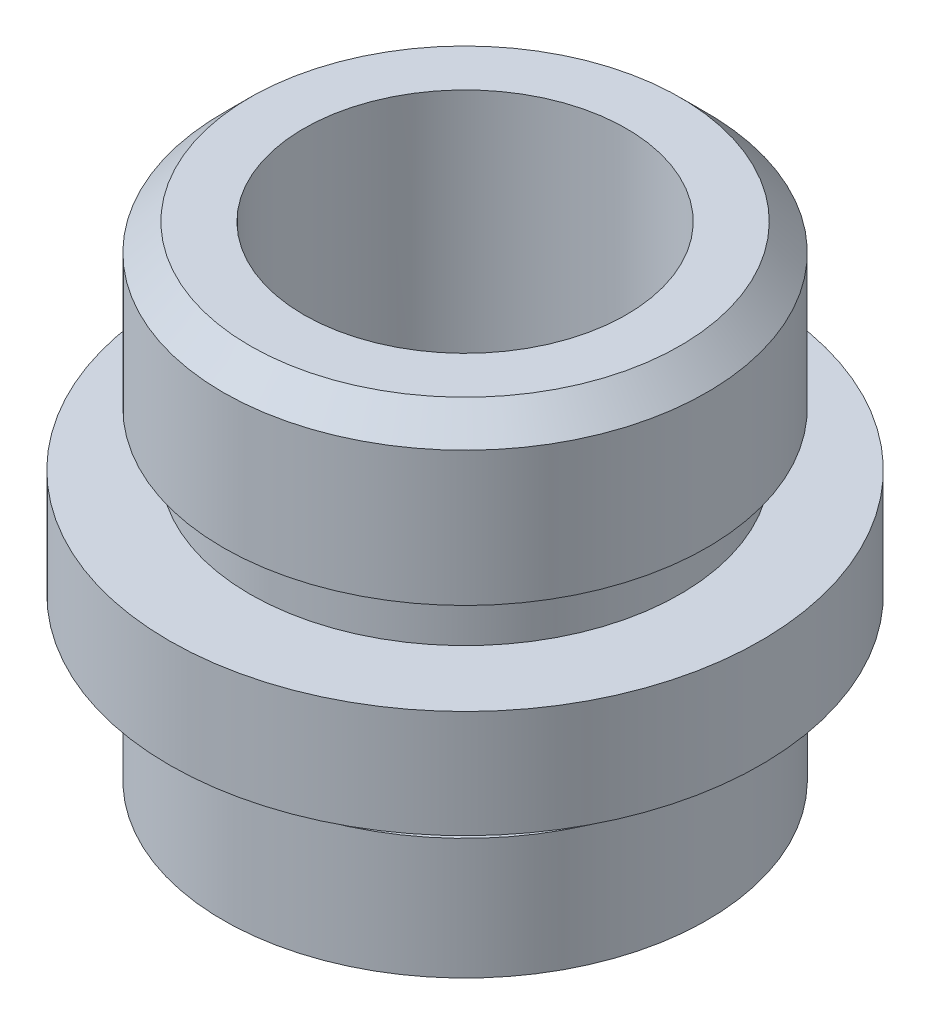
ISO-10303-21;
HEADER;
FILE_DESCRIPTION(('STEP AP214'),'2;1');
FILE_NAME('part.step','',(''),(''),'','','');
FILE_SCHEMA(('AUTOMOTIVE_DESIGN { 1 0 10303 214 1 1 1 1 }'));
ENDSEC;
DATA;
#1=APPLICATION_CONTEXT('core data for automotive mechanical design processes');
#2=APPLICATION_PROTOCOL_DEFINITION('international standard','automotive_design',2000,#1);
#3=PRODUCT_CONTEXT('',#1,'mechanical');
#4=PRODUCT('Part','Part','',(#3));
#5=PRODUCT_RELATED_PRODUCT_CATEGORY('part','',(#4));
#6=PRODUCT_DEFINITION_FORMATION('','',#4);
#7=PRODUCT_DEFINITION_CONTEXT('part definition',#1,'design');
#8=PRODUCT_DEFINITION('design','',#6,#7);
#9=PRODUCT_DEFINITION_SHAPE('','',#8);
#10=(LENGTH_UNIT() NAMED_UNIT(*) SI_UNIT(.MILLI.,.METRE.));
#11=(NAMED_UNIT(*) PLANE_ANGLE_UNIT() SI_UNIT($,.RADIAN.));
#12=(NAMED_UNIT(*) SI_UNIT($,.STERADIAN.) SOLID_ANGLE_UNIT());
#13=UNCERTAINTY_MEASURE_WITH_UNIT(LENGTH_MEASURE(1.E-05),#10,'distance_accuracy_value','');
#14=(GEOMETRIC_REPRESENTATION_CONTEXT(3) GLOBAL_UNCERTAINTY_ASSIGNED_CONTEXT((#13)) GLOBAL_UNIT_ASSIGNED_CONTEXT((#10,
#11,#12)) REPRESENTATION_CONTEXT('',''));
#15=CARTESIAN_POINT('',(0.,0.,0.));
#16=DIRECTION('',(0.,0.,1.));
#17=DIRECTION('',(1.,0.,0.));
#18=AXIS2_PLACEMENT_3D('',#15,#16,#17);
#19=CARTESIAN_POINT('',(0.,-4.,0.));
#20=DIRECTION('',(0.,1.,0.));
#21=DIRECTION('',(0.,0.,1.));
#22=AXIS2_PLACEMENT_3D('',#19,#20,#21);
#23=CYLINDRICAL_SURFACE('',#22,22.);
#24=CARTESIAN_POINT('',(0.,-4.,0.));
#25=DIRECTION('',(0.,1.,0.));
#26=DIRECTION('',(0.,0.,1.));
#27=AXIS2_PLACEMENT_3D('',#24,#25,#26);
#28=CIRCLE('',#27,22.);
#29=CARTESIAN_POINT('',(0.,-4.,22.));
#30=VERTEX_POINT('',#29);
#31=EDGE_CURVE('E61',#30,#30,#28,.T.);
#32=ORIENTED_EDGE('',*,*,#31,.T.);
#33=EDGE_LOOP('',(#32));
#34=FACE_BOUND('',#33,.T.);
#35=CARTESIAN_POINT('',(0.,4.,0.));
#36=DIRECTION('',(0.,1.,0.));
#37=DIRECTION('',(0.,0.,1.));
#38=AXIS2_PLACEMENT_3D('',#35,#36,#37);
#39=CIRCLE('',#38,22.);
#40=CARTESIAN_POINT('',(0.,4.,22.));
#41=VERTEX_POINT('',#40);
#42=EDGE_CURVE('E65',#41,#41,#39,.T.);
#43=ORIENTED_EDGE('',*,*,#42,.F.);
#44=EDGE_LOOP('',(#43));
#45=FACE_BOUND('',#44,.T.);
#46=ADVANCED_FACE('F39',(#34,#45),#23,.T.);
#47=CARTESIAN_POINT('',(0.,-4.,0.));
#48=DIRECTION('',(0.,1.,0.));
#49=DIRECTION('',(0.,0.,1.));
#50=AXIS2_PLACEMENT_3D('',#47,#48,#49);
#51=PLANE('',#50);
#52=CARTESIAN_POINT('',(0.,-4.,0.));
#53=DIRECTION('',(0.,-1.,0.));
#54=DIRECTION('',(0.,0.,-1.));
#55=AXIS2_PLACEMENT_3D('',#52,#53,#54);
#56=CIRCLE('',#55,16.);
#57=CARTESIAN_POINT('',(0.,-4.,-16.));
#58=VERTEX_POINT('',#57);
#59=EDGE_CURVE('E53',#58,#58,#56,.T.);
#60=ORIENTED_EDGE('',*,*,#59,.F.);
#61=EDGE_LOOP('',(#60));
#62=FACE_BOUND('',#61,.T.);
#63=ORIENTED_EDGE('',*,*,#31,.F.);
#64=EDGE_LOOP('',(#63));
#65=FACE_BOUND('',#64,.T.);
#66=ADVANCED_FACE('F120',(#62,#65),#51,.F.);
#67=CARTESIAN_POINT('',(0.,4.,0.));
#68=DIRECTION('',(0.,1.,0.));
#69=DIRECTION('',(0.,0.,1.));
#70=AXIS2_PLACEMENT_3D('',#67,#68,#69);
#71=PLANE('',#70);
#72=CARTESIAN_POINT('',(0.,4.,0.));
#73=DIRECTION('',(0.,1.,0.));
#74=DIRECTION('',(0.,0.,1.));
#75=AXIS2_PLACEMENT_3D('',#72,#73,#74);
#76=CIRCLE('',#75,16.);
#77=CARTESIAN_POINT('',(0.,4.,16.));
#78=VERTEX_POINT('',#77);
#79=EDGE_CURVE('E58',#78,#78,#76,.T.);
#80=ORIENTED_EDGE('',*,*,#79,.F.);
#81=EDGE_LOOP('',(#80));
#82=FACE_BOUND('',#81,.T.);
#83=ORIENTED_EDGE('',*,*,#42,.T.);
#84=EDGE_LOOP('',(#83));
#85=FACE_BOUND('',#84,.T.);
#86=ADVANCED_FACE('F125',(#82,#85),#71,.T.);
#87=CARTESIAN_POINT('',(0.,8.,0.));
#88=DIRECTION('',(0.,-1.,0.));
#89=DIRECTION('',(0.,0.,-1.));
#90=AXIS2_PLACEMENT_3D('',#87,#88,#89);
#91=CYLINDRICAL_SURFACE('',#90,16.);
#92=CARTESIAN_POINT('',(0.,8.,0.));
#93=DIRECTION('',(0.,1.,0.));
#94=DIRECTION('',(0.,0.,1.));
#95=AXIS2_PLACEMENT_3D('',#92,#93,#94);
#96=CIRCLE('',#95,16.);
#97=CARTESIAN_POINT('',(0.,8.,16.));
#98=VERTEX_POINT('',#97);
#99=EDGE_CURVE('E69',#98,#98,#96,.T.);
#100=ORIENTED_EDGE('',*,*,#99,.F.);
#101=EDGE_LOOP('',(#100));
#102=FACE_BOUND('',#101,.T.);
#103=ORIENTED_EDGE('',*,*,#79,.T.);
#104=EDGE_LOOP('',(#103));
#105=FACE_BOUND('',#104,.T.);
#106=ADVANCED_FACE('F116',(#102,#105),#91,.T.);
#107=CARTESIAN_POINT('',(0.,20.,0.));
#108=DIRECTION('',(0.,-1.,0.));
#109=DIRECTION('',(0.,0.,-1.));
#110=AXIS2_PLACEMENT_3D('',#107,#108,#109);
#111=CYLINDRICAL_SURFACE('',#110,18.);
#112=CARTESIAN_POINT('',(0.,18.,0.));
#113=DIRECTION('',(0.,1.,0.));
#114=DIRECTION('',(0.,0.,1.));
#115=AXIS2_PLACEMENT_3D('',#112,#113,#114);
#116=CIRCLE('',#115,18.);
#117=CARTESIAN_POINT('',(0.,18.,18.));
#118=VERTEX_POINT('',#117);
#119=EDGE_CURVE('E10',#118,#118,#116,.F.);
#120=ORIENTED_EDGE('',*,*,#119,.T.);
#121=EDGE_LOOP('',(#120));
#122=FACE_BOUND('',#121,.T.);
#123=CARTESIAN_POINT('',(0.,8.,0.));
#124=DIRECTION('',(0.,1.,0.));
#125=DIRECTION('',(0.,0.,1.));
#126=AXIS2_PLACEMENT_3D('',#123,#124,#125);
#127=CIRCLE('',#126,18.);
#128=CARTESIAN_POINT('',(0.,8.,18.));
#129=VERTEX_POINT('',#128);
#130=EDGE_CURVE('E76',#129,#129,#127,.T.);
#131=ORIENTED_EDGE('',*,*,#130,.T.);
#132=EDGE_LOOP('',(#131));
#133=FACE_BOUND('',#132,.T.);
#134=ADVANCED_FACE('F107',(#122,#133),#111,.T.);
#135=CARTESIAN_POINT('',(0.,20.,0.));
#136=DIRECTION('',(0.,1.,0.));
#137=DIRECTION('',(0.,0.,1.));
#138=AXIS2_PLACEMENT_3D('',#135,#136,#137);
#139=PLANE('',#138);
#140=CARTESIAN_POINT('',(0.,20.,0.));
#141=DIRECTION('',(0.,1.,0.));
#142=DIRECTION('',(0.,0.,1.));
#143=AXIS2_PLACEMENT_3D('',#140,#141,#142);
#144=CIRCLE('',#143,12.);
#145=CARTESIAN_POINT('',(0.,20.,12.));
#146=VERTEX_POINT('',#145);
#147=EDGE_CURVE('E96',#146,#146,#144,.T.);
#148=ORIENTED_EDGE('',*,*,#147,.F.);
#149=EDGE_LOOP('',(#148));
#150=FACE_BOUND('',#149,.T.);
#151=CARTESIAN_POINT('',(0.,20.,0.));
#152=DIRECTION('',(0.,1.,0.));
#153=DIRECTION('',(0.,0.,1.));
#154=AXIS2_PLACEMENT_3D('',#151,#152,#153);
#155=CIRCLE('',#154,16.);
#156=CARTESIAN_POINT('',(0.,20.,16.));
#157=VERTEX_POINT('',#156);
#158=EDGE_CURVE('E48',#157,#157,#155,.T.);
#159=ORIENTED_EDGE('',*,*,#158,.T.);
#160=EDGE_LOOP('',(#159));
#161=FACE_BOUND('',#160,.T.);
#162=ADVANCED_FACE('F104',(#150,#161),#139,.T.);
#163=CARTESIAN_POINT('',(0.,8.,0.));
#164=DIRECTION('',(0.,1.,0.));
#165=DIRECTION('',(0.,0.,1.));
#166=AXIS2_PLACEMENT_3D('',#163,#164,#165);
#167=PLANE('',#166);
#168=ORIENTED_EDGE('',*,*,#99,.T.);
#169=EDGE_LOOP('',(#168));
#170=FACE_BOUND('',#169,.T.);
#171=ORIENTED_EDGE('',*,*,#130,.F.);
#172=EDGE_LOOP('',(#171));
#173=FACE_BOUND('',#172,.T.);
#174=ADVANCED_FACE('F106',(#170,#173),#167,.F.);
#175=CARTESIAN_POINT('',(0.,-7.,0.));
#176=DIRECTION('',(0.,1.,0.));
#177=DIRECTION('',(0.,0.,1.));
#178=AXIS2_PLACEMENT_3D('',#175,#176,#177);
#179=CYLINDRICAL_SURFACE('',#178,16.);
#180=CARTESIAN_POINT('',(0.,-7.,0.));
#181=DIRECTION('',(0.,-1.,0.));
#182=DIRECTION('',(0.,0.,-1.));
#183=AXIS2_PLACEMENT_3D('',#180,#181,#182);
#184=CIRCLE('',#183,16.);
#185=CARTESIAN_POINT('',(0.,-7.,-16.));
#186=VERTEX_POINT('',#185);
#187=EDGE_CURVE('E79',#186,#186,#184,.T.);
#188=ORIENTED_EDGE('',*,*,#187,.F.);
#189=EDGE_LOOP('',(#188));
#190=FACE_BOUND('',#189,.T.);
#191=ORIENTED_EDGE('',*,*,#59,.T.);
#192=EDGE_LOOP('',(#191));
#193=FACE_BOUND('',#192,.T.);
#194=ADVANCED_FACE('F113',(#190,#193),#179,.T.);
#195=CARTESIAN_POINT('',(0.,-16.,0.));
#196=DIRECTION('',(0.,1.,0.));
#197=DIRECTION('',(0.,0.,1.));
#198=AXIS2_PLACEMENT_3D('',#195,#196,#197);
#199=CYLINDRICAL_SURFACE('',#198,18.);
#200=CARTESIAN_POINT('',(0.,-16.,0.));
#201=DIRECTION('',(0.,-1.,0.));
#202=DIRECTION('',(0.,0.,-1.));
#203=AXIS2_PLACEMENT_3D('',#200,#201,#202);
#204=CIRCLE('',#203,18.);
#205=CARTESIAN_POINT('',(0.,-16.,-18.));
#206=VERTEX_POINT('',#205);
#207=EDGE_CURVE('E84',#206,#206,#204,.T.);
#208=ORIENTED_EDGE('',*,*,#207,.F.);
#209=EDGE_LOOP('',(#208));
#210=FACE_BOUND('',#209,.T.);
#211=CARTESIAN_POINT('',(0.,-7.,0.));
#212=DIRECTION('',(0.,-1.,0.));
#213=DIRECTION('',(0.,0.,-1.));
#214=AXIS2_PLACEMENT_3D('',#211,#212,#213);
#215=CIRCLE('',#214,18.);
#216=CARTESIAN_POINT('',(0.,-7.,-18.));
#217=VERTEX_POINT('',#216);
#218=EDGE_CURVE('E85',#217,#217,#215,.T.);
#219=ORIENTED_EDGE('',*,*,#218,.T.);
#220=EDGE_LOOP('',(#219));
#221=FACE_BOUND('',#220,.T.);
#222=ADVANCED_FACE('F183',(#210,#221),#199,.T.);
#223=CARTESIAN_POINT('',(0.,-16.,0.));
#224=DIRECTION('',(0.,-1.,0.));
#225=DIRECTION('',(0.,0.,-1.));
#226=AXIS2_PLACEMENT_3D('',#223,#224,#225);
#227=PLANE('',#226);
#228=CARTESIAN_POINT('',(0.,-16.,0.));
#229=DIRECTION('',(0.,-1.,0.));
#230=DIRECTION('',(0.,0.,-1.));
#231=AXIS2_PLACEMENT_3D('',#228,#229,#230);
#232=CIRCLE('',#231,12.);
#233=CARTESIAN_POINT('',(0.,-16.,-12.));
#234=VERTEX_POINT('',#233);
#235=EDGE_CURVE('E89',#234,#234,#232,.F.);
#236=ORIENTED_EDGE('',*,*,#235,.T.);
#237=EDGE_LOOP('',(#236));
#238=FACE_BOUND('',#237,.T.);
#239=ORIENTED_EDGE('',*,*,#207,.T.);
#240=EDGE_LOOP('',(#239));
#241=FACE_BOUND('',#240,.T.);
#242=ADVANCED_FACE('F178',(#238,#241),#227,.T.);
#243=CARTESIAN_POINT('',(0.,-7.,0.));
#244=DIRECTION('',(0.,-1.,0.));
#245=DIRECTION('',(0.,0.,-1.));
#246=AXIS2_PLACEMENT_3D('',#243,#244,#245);
#247=PLANE('',#246);
#248=ORIENTED_EDGE('',*,*,#187,.T.);
#249=EDGE_LOOP('',(#248));
#250=FACE_BOUND('',#249,.T.);
#251=ORIENTED_EDGE('',*,*,#218,.F.);
#252=EDGE_LOOP('',(#251));
#253=FACE_BOUND('',#252,.T.);
#254=ADVANCED_FACE('F159',(#250,#253),#247,.F.);
#255=CARTESIAN_POINT('',(0.,20.,0.));
#256=DIRECTION('',(0.,-1.,0.));
#257=DIRECTION('',(0.,0.,-1.));
#258=AXIS2_PLACEMENT_3D('',#255,#256,#257);
#259=CONICAL_SURFACE('',#258,16.,0.785398163397447);
#260=ORIENTED_EDGE('',*,*,#119,.F.);
#261=EDGE_LOOP('',(#260));
#262=FACE_BOUND('',#261,.T.);
#263=ORIENTED_EDGE('',*,*,#158,.F.);
#264=EDGE_LOOP('',(#263));
#265=FACE_BOUND('',#264,.T.);
#266=ADVANCED_FACE('F42',(#262,#265),#259,.T.);
#267=CARTESIAN_POINT('',(0.,-49.9411254969543,0.));
#268=DIRECTION('',(0.,1.,0.));
#269=DIRECTION('',(0.,0.,1.));
#270=AXIS2_PLACEMENT_3D('',#267,#268,#269);
#271=CYLINDRICAL_SURFACE('',#270,12.);
#272=ORIENTED_EDGE('',*,*,#147,.T.);
#273=EDGE_LOOP('',(#272));
#274=FACE_BOUND('',#273,.T.);
#275=ORIENTED_EDGE('',*,*,#235,.F.);
#276=EDGE_LOOP('',(#275));
#277=FACE_BOUND('',#276,.T.);
#278=ADVANCED_FACE('F101',(#274,#277),#271,.F.);
#279=CLOSED_SHELL('',(#46,#66,#86,#106,#134,#162,#174,#194,#222,#242,#254,#266,#278));
#280=MANIFOLD_SOLID_BREP('B2',#279);
#281=ADVANCED_BREP_SHAPE_REPRESENTATION('',(#18,#280),#14);
#282=SHAPE_DEFINITION_REPRESENTATION(#9,#281);
ENDSEC;
END-ISO-10303-21;
